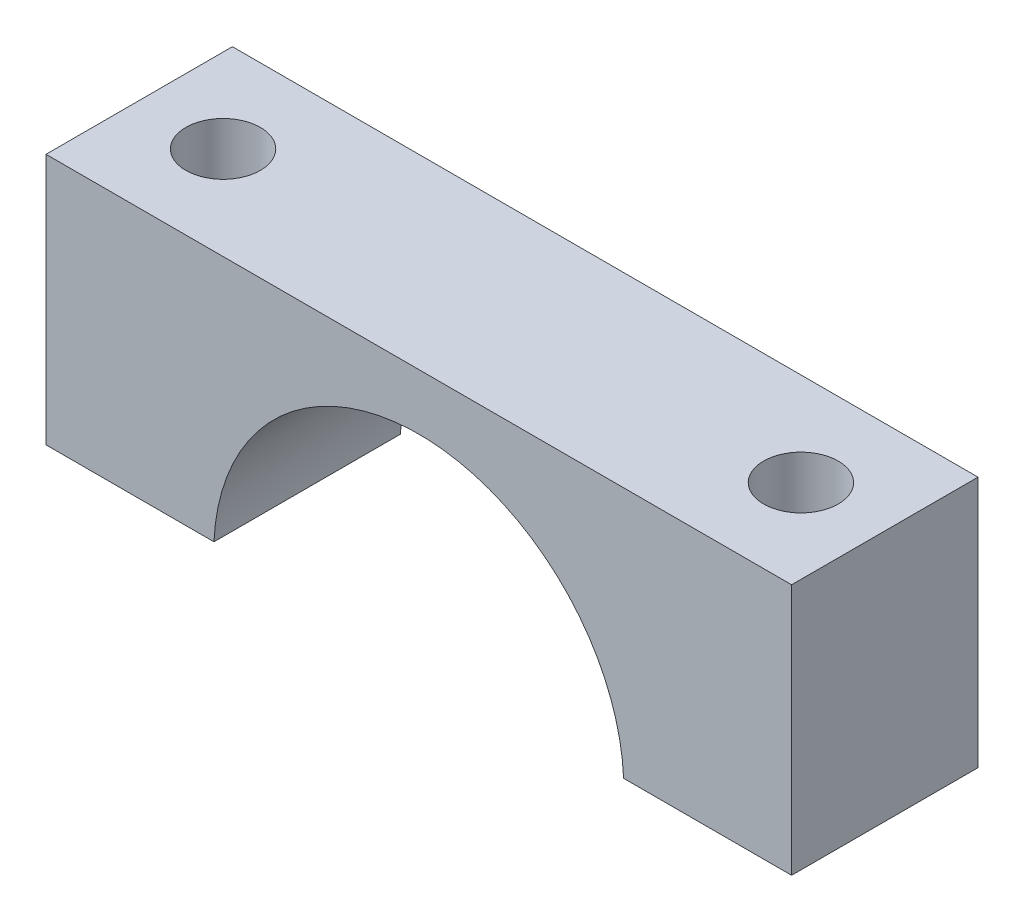
ISO-10303-21;
HEADER;
FILE_DESCRIPTION(('STEP AP214'),'2;1');
FILE_NAME('part.step','',(''),(''),'','','');
FILE_SCHEMA(('AUTOMOTIVE_DESIGN { 1 0 10303 214 1 1 1 1 }'));
ENDSEC;
DATA;
#1=APPLICATION_CONTEXT('core data for automotive mechanical design processes');
#2=APPLICATION_PROTOCOL_DEFINITION('international standard','automotive_design',2000,#1);
#3=PRODUCT_CONTEXT('',#1,'mechanical');
#4=PRODUCT('Part','Part','',(#3));
#5=PRODUCT_RELATED_PRODUCT_CATEGORY('part','',(#4));
#6=PRODUCT_DEFINITION_FORMATION('','',#4);
#7=PRODUCT_DEFINITION_CONTEXT('part definition',#1,'design');
#8=PRODUCT_DEFINITION('design','',#6,#7);
#9=PRODUCT_DEFINITION_SHAPE('','',#8);
#10=(LENGTH_UNIT() NAMED_UNIT(*) SI_UNIT(.MILLI.,.METRE.));
#11=(NAMED_UNIT(*) PLANE_ANGLE_UNIT() SI_UNIT($,.RADIAN.));
#12=(NAMED_UNIT(*) SI_UNIT($,.STERADIAN.) SOLID_ANGLE_UNIT());
#13=UNCERTAINTY_MEASURE_WITH_UNIT(LENGTH_MEASURE(1.E-05),#10,'distance_accuracy_value','');
#14=(GEOMETRIC_REPRESENTATION_CONTEXT(3) GLOBAL_UNCERTAINTY_ASSIGNED_CONTEXT((#13)) GLOBAL_UNIT_ASSIGNED_CONTEXT((#10,
#11,#12)) REPRESENTATION_CONTEXT('',''));
#15=CARTESIAN_POINT('',(0.,0.,0.));
#16=DIRECTION('',(0.,0.,1.));
#17=DIRECTION('',(1.,0.,0.));
#18=AXIS2_PLACEMENT_3D('',#15,#16,#17);
#19=CARTESIAN_POINT('',(0.,0.,0.));
#20=DIRECTION('',(0.,1.,0.));
#21=DIRECTION('',(0.,0.,1.));
#22=AXIS2_PLACEMENT_3D('',#19,#20,#21);
#23=PLANE('',#22);
#24=CARTESIAN_POINT('',(-10.9109589041096,0.,-9.65753424657535));
#25=DIRECTION('',(0.,1.,0.));
#26=DIRECTION('',(0.,0.,1.));
#27=AXIS2_PLACEMENT_3D('',#24,#25,#26);
#28=CIRCLE('',#27,2.);
#29=CARTESIAN_POINT('',(-10.9109589041096,0.,-7.65753424657535));
#30=VERTEX_POINT('',#29);
#31=EDGE_CURVE('E140',#30,#30,#28,.T.);
#32=ORIENTED_EDGE('',*,*,#31,.T.);
#33=EDGE_LOOP('',(#32));
#34=FACE_BOUND('',#33,.T.);
#35=DIRECTION('',(-1.,0.,0.));
#36=VECTOR('',#35,1.);
#37=CARTESIAN_POINT('',(-15.4109589041096,0.,-14.6575342465753));
#38=LINE('',#37,#36);
#39=CARTESIAN_POINT('',(-6.39958939202756,0.,-14.6575342465753));
#40=VERTEX_POINT('',#39);
#41=CARTESIAN_POINT('',(-15.4109589041096,0.,-14.6575342465753));
#42=VERTEX_POINT('',#41);
#43=EDGE_CURVE('E79',#40,#42,#38,.T.);
#44=ORIENTED_EDGE('',*,*,#43,.F.);
#45=DIRECTION('',(0.,0.,1.));
#46=VECTOR('',#45,1.);
#47=CARTESIAN_POINT('',(-6.39958939202756,0.,-14.6575342465753));
#48=LINE('',#47,#46);
#49=CARTESIAN_POINT('',(-6.39958939202756,0.,-4.65753424657535));
#50=VERTEX_POINT('',#49);
#51=EDGE_CURVE('E94',#40,#50,#48,.T.);
#52=ORIENTED_EDGE('',*,*,#51,.T.);
#53=DIRECTION('',(1.,0.,0.));
#54=VECTOR('',#53,1.);
#55=CARTESIAN_POINT('',(-15.4109589041096,0.,-4.65753424657535));
#56=LINE('',#55,#54);
#57=CARTESIAN_POINT('',(-15.4109589041096,0.,-4.65753424657535));
#58=VERTEX_POINT('',#57);
#59=EDGE_CURVE('E114',#58,#50,#56,.T.);
#60=ORIENTED_EDGE('',*,*,#59,.F.);
#61=DIRECTION('',(0.,0.,1.));
#62=VECTOR('',#61,1.);
#63=CARTESIAN_POINT('',(-15.4109589041096,0.,-14.6575342465753));
#64=LINE('',#63,#62);
#65=EDGE_CURVE('E100',#42,#58,#64,.T.);
#66=ORIENTED_EDGE('',*,*,#65,.F.);
#67=EDGE_LOOP('',(#44,#52,#60,#66));
#68=FACE_BOUND('',#67,.T.);
#69=ADVANCED_FACE('F35',(#34,#68),#23,.F.);
#70=CARTESIAN_POINT('',(-15.4109589041096,13.5,-14.6575342465753));
#71=DIRECTION('',(1.,0.,0.));
#72=DIRECTION('',(0.,0.,-1.));
#73=AXIS2_PLACEMENT_3D('',#70,#71,#72);
#74=PLANE('',#73);
#75=ORIENTED_EDGE('',*,*,#65,.T.);
#76=DIRECTION('',(0.,-1.,0.));
#77=VECTOR('',#76,1.);
#78=CARTESIAN_POINT('',(-15.4109589041096,13.5,-4.65753424657535));
#79=LINE('',#78,#77);
#80=CARTESIAN_POINT('',(-15.4109589041096,13.5,-4.65753424657535));
#81=VERTEX_POINT('',#80);
#82=EDGE_CURVE('E11',#81,#58,#79,.T.);
#83=ORIENTED_EDGE('',*,*,#82,.F.);
#84=DIRECTION('',(0.,0.,1.));
#85=VECTOR('',#84,1.);
#86=CARTESIAN_POINT('',(-15.4109589041096,13.5,-14.6575342465753));
#87=LINE('',#86,#85);
#88=CARTESIAN_POINT('',(-15.4109589041096,13.5,-14.6575342465753));
#89=VERTEX_POINT('',#88);
#90=EDGE_CURVE('E113',#89,#81,#87,.T.);
#91=ORIENTED_EDGE('',*,*,#90,.F.);
#92=DIRECTION('',(0.,-1.,0.));
#93=VECTOR('',#92,1.);
#94=CARTESIAN_POINT('',(-15.4109589041096,13.5,-14.6575342465753));
#95=LINE('',#94,#93);
#96=EDGE_CURVE('E118',#89,#42,#95,.T.);
#97=ORIENTED_EDGE('',*,*,#96,.T.);
#98=EDGE_LOOP('',(#75,#83,#91,#97));
#99=FACE_BOUND('',#98,.T.);
#100=ADVANCED_FACE('F37',(#99),#74,.F.);
#101=CARTESIAN_POINT('',(-15.4109589041096,13.5,-4.65753424657535));
#102=DIRECTION('',(0.,0.,-1.));
#103=DIRECTION('',(-1.,0.,0.));
#104=AXIS2_PLACEMENT_3D('',#101,#102,#103);
#105=PLANE('',#104);
#106=ORIENTED_EDGE('',*,*,#59,.T.);
#107=CARTESIAN_POINT('',(4.5890410958904,-0.500000000000003,-4.65753424657535));
#108=DIRECTION('',(0.,0.,1.));
#109=DIRECTION('',(1.,0.,0.));
#110=AXIS2_PLACEMENT_3D('',#107,#108,#109);
#111=CIRCLE('',#110,11.);
#112=CARTESIAN_POINT('',(15.5776715838084,0.,-4.65753424657535));
#113=VERTEX_POINT('',#112);
#114=EDGE_CURVE('E97',#113,#50,#111,.T.);
#115=ORIENTED_EDGE('',*,*,#114,.F.);
#116=CARTESIAN_POINT('',(24.5890410958904,0.,-4.65753424657535));
#117=VERTEX_POINT('',#116);
#118=EDGE_CURVE('E131',#113,#117,#56,.T.);
#119=ORIENTED_EDGE('',*,*,#118,.T.);
#120=DIRECTION('',(0.,-1.,0.));
#121=VECTOR('',#120,1.);
#122=CARTESIAN_POINT('',(24.5890410958904,13.5,-4.65753424657535));
#123=LINE('',#122,#121);
#124=CARTESIAN_POINT('',(24.5890410958904,13.5,-4.65753424657535));
#125=VERTEX_POINT('',#124);
#126=EDGE_CURVE('E43',#125,#117,#123,.T.);
#127=ORIENTED_EDGE('',*,*,#126,.F.);
#128=DIRECTION('',(1.,0.,0.));
#129=VECTOR('',#128,1.);
#130=CARTESIAN_POINT('',(-15.4109589041096,13.5,-4.65753424657535));
#131=LINE('',#130,#129);
#132=EDGE_CURVE('E86',#81,#125,#131,.T.);
#133=ORIENTED_EDGE('',*,*,#132,.F.);
#134=ORIENTED_EDGE('',*,*,#82,.T.);
#135=EDGE_LOOP('',(#106,#115,#119,#127,#133,#134));
#136=FACE_BOUND('',#135,.T.);
#137=ADVANCED_FACE('F139',(#136),#105,.F.);
#138=CARTESIAN_POINT('',(24.5890410958904,13.5,-14.6575342465753));
#139=DIRECTION('',(-1.,0.,0.));
#140=DIRECTION('',(0.,0.,1.));
#141=AXIS2_PLACEMENT_3D('',#138,#139,#140);
#142=PLANE('',#141);
#143=DIRECTION('',(0.,0.,-1.));
#144=VECTOR('',#143,1.);
#145=CARTESIAN_POINT('',(24.5890410958904,0.,-14.6575342465753));
#146=LINE('',#145,#144);
#147=CARTESIAN_POINT('',(24.5890410958904,0.,-14.6575342465753));
#148=VERTEX_POINT('',#147);
#149=EDGE_CURVE('E111',#117,#148,#146,.T.);
#150=ORIENTED_EDGE('',*,*,#149,.T.);
#151=DIRECTION('',(0.,-1.,0.));
#152=VECTOR('',#151,1.);
#153=CARTESIAN_POINT('',(24.5890410958904,13.5,-14.6575342465753));
#154=LINE('',#153,#152);
#155=CARTESIAN_POINT('',(24.5890410958904,13.5,-14.6575342465753));
#156=VERTEX_POINT('',#155);
#157=EDGE_CURVE('E120',#156,#148,#154,.T.);
#158=ORIENTED_EDGE('',*,*,#157,.F.);
#159=DIRECTION('',(0.,0.,-1.));
#160=VECTOR('',#159,1.);
#161=CARTESIAN_POINT('',(24.5890410958904,13.5,-14.6575342465753));
#162=LINE('',#161,#160);
#163=EDGE_CURVE('E127',#125,#156,#162,.T.);
#164=ORIENTED_EDGE('',*,*,#163,.F.);
#165=ORIENTED_EDGE('',*,*,#126,.T.);
#166=EDGE_LOOP('',(#150,#158,#164,#165));
#167=FACE_BOUND('',#166,.T.);
#168=ADVANCED_FACE('F125',(#167),#142,.F.);
#169=CARTESIAN_POINT('',(-15.4109589041096,13.5,-14.6575342465753));
#170=DIRECTION('',(0.,0.,1.));
#171=DIRECTION('',(1.,0.,0.));
#172=AXIS2_PLACEMENT_3D('',#169,#170,#171);
#173=PLANE('',#172);
#174=CARTESIAN_POINT('',(15.5776715838083,0.,-14.6575342465753));
#175=VERTEX_POINT('',#174);
#176=EDGE_CURVE('E107',#148,#175,#38,.T.);
#177=ORIENTED_EDGE('',*,*,#176,.T.);
#178=CARTESIAN_POINT('',(4.5890410958904,-0.500000000000003,-14.6575342465753));
#179=DIRECTION('',(0.,0.,1.));
#180=DIRECTION('',(1.,0.,0.));
#181=AXIS2_PLACEMENT_3D('',#178,#179,#180);
#182=CIRCLE('',#181,11.);
#183=EDGE_CURVE('E50',#175,#40,#182,.T.);
#184=ORIENTED_EDGE('',*,*,#183,.T.);
#185=ORIENTED_EDGE('',*,*,#43,.T.);
#186=ORIENTED_EDGE('',*,*,#96,.F.);
#187=DIRECTION('',(-1.,0.,0.));
#188=VECTOR('',#187,1.);
#189=CARTESIAN_POINT('',(-15.4109589041096,13.5,-14.6575342465753));
#190=LINE('',#189,#188);
#191=EDGE_CURVE('E59',#156,#89,#190,.T.);
#192=ORIENTED_EDGE('',*,*,#191,.F.);
#193=ORIENTED_EDGE('',*,*,#157,.T.);
#194=EDGE_LOOP('',(#177,#184,#185,#186,#192,#193));
#195=FACE_BOUND('',#194,.T.);
#196=ADVANCED_FACE('F104',(#195),#173,.F.);
#197=CARTESIAN_POINT('',(0.,13.5,0.));
#198=DIRECTION('',(0.,1.,0.));
#199=DIRECTION('',(0.,0.,1.));
#200=AXIS2_PLACEMENT_3D('',#197,#198,#199);
#201=PLANE('',#200);
#202=CARTESIAN_POINT('',(-10.9109589041096,13.5,-9.65753424657535));
#203=DIRECTION('',(0.,1.,0.));
#204=DIRECTION('',(0.,0.,1.));
#205=AXIS2_PLACEMENT_3D('',#202,#203,#204);
#206=CIRCLE('',#205,2.);
#207=CARTESIAN_POINT('',(-10.9109589041096,13.5,-7.65753424657535));
#208=VERTEX_POINT('',#207);
#209=EDGE_CURVE('E142',#208,#208,#206,.T.);
#210=ORIENTED_EDGE('',*,*,#209,.F.);
#211=EDGE_LOOP('',(#210));
#212=FACE_BOUND('',#211,.T.);
#213=CARTESIAN_POINT('',(20.0890410958904,13.5,-9.65753424657535));
#214=DIRECTION('',(0.,1.,0.));
#215=DIRECTION('',(0.,0.,-1.));
#216=AXIS2_PLACEMENT_3D('',#213,#214,#215);
#217=CIRCLE('',#216,2.);
#218=CARTESIAN_POINT('',(20.0890410958904,13.5,-11.6575342465753));
#219=VERTEX_POINT('',#218);
#220=EDGE_CURVE('E145',#219,#219,#217,.T.);
#221=ORIENTED_EDGE('',*,*,#220,.F.);
#222=EDGE_LOOP('',(#221));
#223=FACE_BOUND('',#222,.T.);
#224=ORIENTED_EDGE('',*,*,#90,.T.);
#225=ORIENTED_EDGE('',*,*,#132,.T.);
#226=ORIENTED_EDGE('',*,*,#163,.T.);
#227=ORIENTED_EDGE('',*,*,#191,.T.);
#228=EDGE_LOOP('',(#224,#225,#226,#227));
#229=FACE_BOUND('',#228,.T.);
#230=ADVANCED_FACE('F156',(#212,#223,#229),#201,.T.);
#231=CARTESIAN_POINT('',(20.0890410958904,0.,-9.65753424657535));
#232=DIRECTION('',(0.,1.,0.));
#233=DIRECTION('',(0.,0.,-1.));
#234=AXIS2_PLACEMENT_3D('',#231,#232,#233);
#235=CIRCLE('',#234,2.);
#236=CARTESIAN_POINT('',(20.0890410958904,0.,-11.6575342465753));
#237=VERTEX_POINT('',#236);
#238=EDGE_CURVE('E148',#237,#237,#235,.T.);
#239=ORIENTED_EDGE('',*,*,#238,.T.);
#240=EDGE_LOOP('',(#239));
#241=FACE_BOUND('',#240,.T.);
#242=ORIENTED_EDGE('',*,*,#118,.F.);
#243=DIRECTION('',(0.,0.,1.));
#244=VECTOR('',#243,1.);
#245=CARTESIAN_POINT('',(15.5776715838084,0.,-14.6575342465753));
#246=LINE('',#245,#244);
#247=EDGE_CURVE('E101',#175,#113,#246,.T.);
#248=ORIENTED_EDGE('',*,*,#247,.F.);
#249=ORIENTED_EDGE('',*,*,#176,.F.);
#250=ORIENTED_EDGE('',*,*,#149,.F.);
#251=EDGE_LOOP('',(#242,#248,#249,#250));
#252=FACE_BOUND('',#251,.T.);
#253=ADVANCED_FACE('F130',(#241,#252),#23,.F.);
#254=CARTESIAN_POINT('',(4.5890410958904,-0.500000000000003,-14.6575342465753));
#255=DIRECTION('',(0.,0.,1.));
#256=DIRECTION('',(1.,0.,0.));
#257=AXIS2_PLACEMENT_3D('',#254,#255,#256);
#258=CYLINDRICAL_SURFACE('',#257,11.);
#259=ORIENTED_EDGE('',*,*,#114,.T.);
#260=ORIENTED_EDGE('',*,*,#51,.F.);
#261=ORIENTED_EDGE('',*,*,#183,.F.);
#262=ORIENTED_EDGE('',*,*,#247,.T.);
#263=EDGE_LOOP('',(#259,#260,#261,#262));
#264=FACE_BOUND('',#263,.T.);
#265=ADVANCED_FACE('F95',(#264),#258,.F.);
#266=CARTESIAN_POINT('',(20.0890410958904,0.,-9.65753424657535));
#267=DIRECTION('',(0.,1.,0.));
#268=DIRECTION('',(0.,0.,1.));
#269=AXIS2_PLACEMENT_3D('',#266,#267,#268);
#270=CYLINDRICAL_SURFACE('',#269,2.);
#271=ORIENTED_EDGE('',*,*,#238,.F.);
#272=EDGE_LOOP('',(#271));
#273=FACE_BOUND('',#272,.T.);
#274=ORIENTED_EDGE('',*,*,#220,.T.);
#275=EDGE_LOOP('',(#274));
#276=FACE_BOUND('',#275,.T.);
#277=ADVANCED_FACE('F179',(#273,#276),#270,.F.);
#278=CARTESIAN_POINT('',(-10.9109589041096,0.,-9.65753424657535));
#279=DIRECTION('',(0.,1.,0.));
#280=DIRECTION('',(0.,0.,1.));
#281=AXIS2_PLACEMENT_3D('',#278,#279,#280);
#282=CYLINDRICAL_SURFACE('',#281,2.);
#283=ORIENTED_EDGE('',*,*,#31,.F.);
#284=EDGE_LOOP('',(#283));
#285=FACE_BOUND('',#284,.T.);
#286=ORIENTED_EDGE('',*,*,#209,.T.);
#287=EDGE_LOOP('',(#286));
#288=FACE_BOUND('',#287,.T.);
#289=ADVANCED_FACE('F154',(#285,#288),#282,.F.);
#290=CLOSED_SHELL('',(#69,#100,#137,#168,#196,#230,#253,#265,#277,#289));
#291=MANIFOLD_SOLID_BREP('B2',#290);
#292=ADVANCED_BREP_SHAPE_REPRESENTATION('',(#18,#291),#14);
#293=SHAPE_DEFINITION_REPRESENTATION(#9,#292);
ENDSEC;
END-ISO-10303-21;
